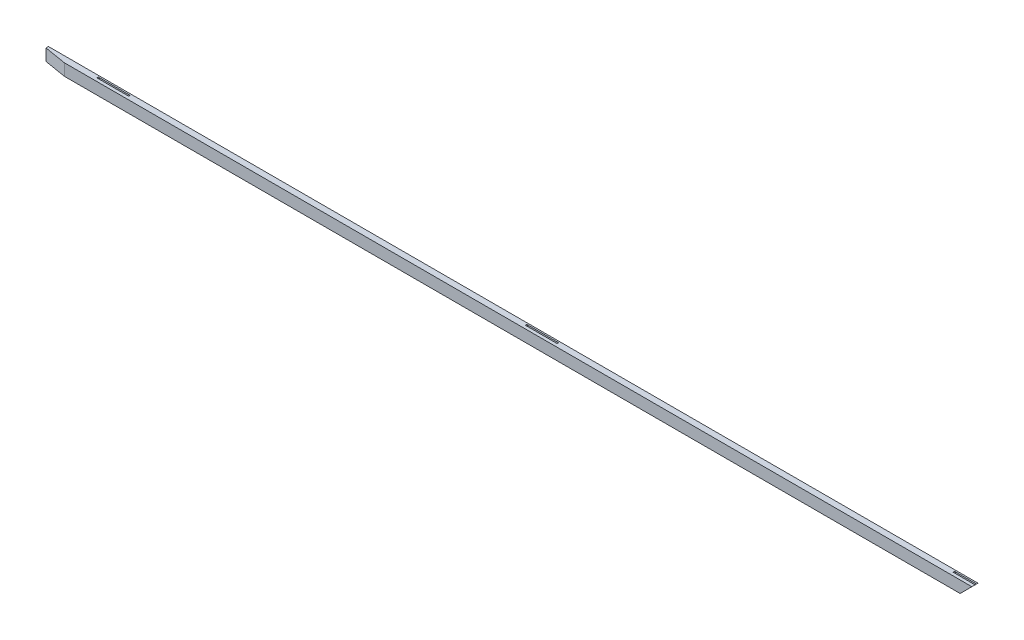
ISO-10303-21;
HEADER;
FILE_DESCRIPTION(('STEP AP214'),'2;1');
FILE_NAME('part.step','',(''),(''),'','','');
FILE_SCHEMA(('AUTOMOTIVE_DESIGN { 1 0 10303 214 1 1 1 1 }'));
ENDSEC;
DATA;
#1=APPLICATION_CONTEXT('core data for automotive mechanical design processes');
#2=APPLICATION_PROTOCOL_DEFINITION('international standard','automotive_design',2000,#1);
#3=PRODUCT_CONTEXT('',#1,'mechanical');
#4=PRODUCT('Part','Part','',(#3));
#5=PRODUCT_RELATED_PRODUCT_CATEGORY('part','',(#4));
#6=PRODUCT_DEFINITION_FORMATION('','',#4);
#7=PRODUCT_DEFINITION_CONTEXT('part definition',#1,'design');
#8=PRODUCT_DEFINITION('design','',#6,#7);
#9=PRODUCT_DEFINITION_SHAPE('','',#8);
#10=(LENGTH_UNIT() NAMED_UNIT(*) SI_UNIT(.MILLI.,.METRE.));
#11=(NAMED_UNIT(*) PLANE_ANGLE_UNIT() SI_UNIT($,.RADIAN.));
#12=(NAMED_UNIT(*) SI_UNIT($,.STERADIAN.) SOLID_ANGLE_UNIT());
#13=UNCERTAINTY_MEASURE_WITH_UNIT(LENGTH_MEASURE(1.E-05),#10,'distance_accuracy_value','');
#14=(GEOMETRIC_REPRESENTATION_CONTEXT(3) GLOBAL_UNCERTAINTY_ASSIGNED_CONTEXT((#13)) GLOBAL_UNIT_ASSIGNED_CONTEXT((#10,
#11,#12)) REPRESENTATION_CONTEXT('',''));
#15=CARTESIAN_POINT('',(0.,0.,0.));
#16=DIRECTION('',(0.,0.,1.));
#17=DIRECTION('',(1.,0.,0.));
#18=AXIS2_PLACEMENT_3D('',#15,#16,#17);
#19=CARTESIAN_POINT('',(3798.,24.0000000000012,25.));
#20=DIRECTION('',(0.,-1.,0.));
#21=DIRECTION('',(1.,0.,0.));
#22=AXIS2_PLACEMENT_3D('',#19,#20,#21);
#23=PLANE('',#22);
#24=DIRECTION('',(0.,0.,1.));
#25=VECTOR('',#24,1.);
#26=CARTESIAN_POINT('',(1960.,23.9999999999998,11.9999999999999));
#27=LINE('',#26,#25);
#28=CARTESIAN_POINT('',(1960.,23.9999999999998,11.9999999999999));
#29=VERTEX_POINT('',#28);
#30=CARTESIAN_POINT('',(1960.,23.9999999999998,6.));
#31=VERTEX_POINT('',#30);
#32=EDGE_CURVE('E247',#29,#31,#27,.F.);
#33=ORIENTED_EDGE('',*,*,#32,.T.);
#34=DIRECTION('',(1.,0.,0.));
#35=VECTOR('',#34,1.);
#36=CARTESIAN_POINT('',(1967.5,23.9999999999998,6.));
#37=LINE('',#36,#35);
#38=CARTESIAN_POINT('',(2090.,23.9999999999998,6.00000000000002));
#39=VERTEX_POINT('',#38);
#40=EDGE_CURVE('E283',#31,#39,#37,.T.);
#41=ORIENTED_EDGE('',*,*,#40,.T.);
#42=DIRECTION('',(0.,0.,-1.));
#43=VECTOR('',#42,1.);
#44=CARTESIAN_POINT('',(2090.,23.9999999999998,6.00000000000001));
#45=LINE('',#44,#43);
#46=CARTESIAN_POINT('',(2090.,23.9999999999998,12.));
#47=VERTEX_POINT('',#46);
#48=EDGE_CURVE('E302',#39,#47,#45,.F.);
#49=ORIENTED_EDGE('',*,*,#48,.T.);
#50=DIRECTION('',(-1.,0.,0.));
#51=VECTOR('',#50,1.);
#52=CARTESIAN_POINT('',(2082.5,23.9999999999998,12.));
#53=LINE('',#52,#51);
#54=EDGE_CURVE('E297',#47,#29,#53,.T.);
#55=ORIENTED_EDGE('',*,*,#54,.T.);
#56=EDGE_LOOP('',(#33,#41,#49,#55));
#57=FACE_BOUND('',#56,.T.);
#58=DIRECTION('',(0.,0.,1.));
#59=VECTOR('',#58,1.);
#60=CARTESIAN_POINT('',(209.999999999999,23.9999999999998,11.9999999999999));
#61=LINE('',#60,#59);
#62=CARTESIAN_POINT('',(209.999999999999,23.9999999999998,11.9999999999999));
#63=VERTEX_POINT('',#62);
#64=CARTESIAN_POINT('',(209.999999999999,23.9999999999998,6.));
#65=VERTEX_POINT('',#64);
#66=EDGE_CURVE('E345',#63,#65,#61,.F.);
#67=ORIENTED_EDGE('',*,*,#66,.T.);
#68=DIRECTION('',(1.,0.,0.));
#69=VECTOR('',#68,1.);
#70=CARTESIAN_POINT('',(217.499999999999,23.9999999999998,6.));
#71=LINE('',#70,#69);
#72=CARTESIAN_POINT('',(339.999999999999,23.9999999999998,6.00000000000002));
#73=VERTEX_POINT('',#72);
#74=EDGE_CURVE('E352',#65,#73,#71,.T.);
#75=ORIENTED_EDGE('',*,*,#74,.T.);
#76=DIRECTION('',(0.,0.,-1.));
#77=VECTOR('',#76,1.);
#78=CARTESIAN_POINT('',(339.999999999999,23.9999999999998,6.00000000000001));
#79=LINE('',#78,#77);
#80=CARTESIAN_POINT('',(339.999999999999,23.9999999999998,12.));
#81=VERTEX_POINT('',#80);
#82=EDGE_CURVE('E11',#73,#81,#79,.F.);
#83=ORIENTED_EDGE('',*,*,#82,.T.);
#84=DIRECTION('',(-1.,0.,0.));
#85=VECTOR('',#84,1.);
#86=CARTESIAN_POINT('',(332.5,23.9999999999998,12.));
#87=LINE('',#86,#85);
#88=EDGE_CURVE('E335',#81,#63,#87,.T.);
#89=ORIENTED_EDGE('',*,*,#88,.T.);
#90=EDGE_LOOP('',(#67,#75,#83,#89));
#91=FACE_BOUND('',#90,.T.);
#92=DIRECTION('',(0.,0.,-1.));
#93=VECTOR('',#92,1.);
#94=CARTESIAN_POINT('',(0.,24.0000000000002,25.));
#95=LINE('',#94,#93);
#96=CARTESIAN_POINT('',(0.,24.0000000000002,10.));
#97=VERTEX_POINT('',#96);
#98=CARTESIAN_POINT('',(0.,24.0000000000002,0.));
#99=VERTEX_POINT('',#98);
#100=EDGE_CURVE('E240',#97,#99,#95,.T.);
#101=ORIENTED_EDGE('',*,*,#100,.F.);
#102=DIRECTION('',(-0.986393923832144,0.,-0.164398987305357));
#103=VECTOR('',#102,1.);
#104=CARTESIAN_POINT('',(0.,24.0000000000002,10.));
#105=LINE('',#104,#103);
#106=CARTESIAN_POINT('',(90.,24.0000000000012,25.));
#107=VERTEX_POINT('',#106);
#108=EDGE_CURVE('E225',#107,#97,#105,.T.);
#109=ORIENTED_EDGE('',*,*,#108,.F.);
#110=DIRECTION('',(-1.,0.,0.));
#111=VECTOR('',#110,1.);
#112=CARTESIAN_POINT('',(3798.,24.0000000000012,25.));
#113=LINE('',#112,#111);
#114=CARTESIAN_POINT('',(3798.,24.0000000000012,25.));
#115=VERTEX_POINT('',#114);
#116=EDGE_CURVE('E733',#115,#107,#113,.T.);
#117=ORIENTED_EDGE('',*,*,#116,.F.);
#118=DIRECTION('',(0.,0.,-1.));
#119=VECTOR('',#118,1.);
#120=CARTESIAN_POINT('',(3798.,24.0000000000012,25.));
#121=LINE('',#120,#119);
#122=CARTESIAN_POINT('',(3798.,24.0000000000012,12.));
#123=VERTEX_POINT('',#122);
#124=EDGE_CURVE('E728',#115,#123,#121,.T.);
#125=ORIENTED_EDGE('',*,*,#124,.T.);
#126=DIRECTION('',(-1.,0.,0.));
#127=VECTOR('',#126,1.);
#128=CARTESIAN_POINT('',(3798.,24.0000000000012,12.));
#129=LINE('',#128,#127);
#130=CARTESIAN_POINT('',(3708.5,24.0000000000012,12.));
#131=VERTEX_POINT('',#130);
#132=EDGE_CURVE('E714',#123,#131,#129,.T.);
#133=ORIENTED_EDGE('',*,*,#132,.T.);
#134=DIRECTION('',(0.,0.,1.));
#135=VECTOR('',#134,1.);
#136=CARTESIAN_POINT('',(3708.5,24.0000000000012,6.));
#137=LINE('',#136,#135);
#138=CARTESIAN_POINT('',(3708.5,24.0000000000012,6.));
#139=VERTEX_POINT('',#138);
#140=EDGE_CURVE('E801',#139,#131,#137,.T.);
#141=ORIENTED_EDGE('',*,*,#140,.F.);
#142=DIRECTION('',(-1.,0.,0.));
#143=VECTOR('',#142,1.);
#144=CARTESIAN_POINT('',(3798.,24.0000000000012,6.));
#145=LINE('',#144,#143);
#146=CARTESIAN_POINT('',(3798.,24.0000000000012,6.));
#147=VERTEX_POINT('',#146);
#148=EDGE_CURVE('E730',#147,#139,#145,.T.);
#149=ORIENTED_EDGE('',*,*,#148,.F.);
#150=CARTESIAN_POINT('',(3798.,24.0000000000012,0.));
#151=VERTEX_POINT('',#150);
#152=EDGE_CURVE('E735',#147,#151,#121,.T.);
#153=ORIENTED_EDGE('',*,*,#152,.T.);
#154=DIRECTION('',(-1.,0.,0.));
#155=VECTOR('',#154,1.);
#156=CARTESIAN_POINT('',(3798.,24.0000000000012,0.));
#157=LINE('',#156,#155);
#158=EDGE_CURVE('E246',#151,#99,#157,.T.);
#159=ORIENTED_EDGE('',*,*,#158,.T.);
#160=EDGE_LOOP('',(#101,#109,#117,#125,#133,#141,#149,#153,#159));
#161=FACE_BOUND('',#160,.T.);
#162=ADVANCED_FACE('F35',(#57,#91,#161),#23,.F.);
#163=CARTESIAN_POINT('',(3750.,-23.9999999999998,25.));
#164=DIRECTION('',(-0.707106781186548,0.707106781186547,0.));
#165=DIRECTION('',(-0.707106781186547,-0.707106781186548,0.));
#166=AXIS2_PLACEMENT_3D('',#163,#164,#165);
#167=PLANE('',#166);
#168=DIRECTION('',(0.70710678118654,0.707106781186556,0.));
#169=VECTOR('',#168,1.);
#170=CARTESIAN_POINT('',(3790.5,16.5000000000012,6.));
#171=LINE('',#170,#169);
#172=CARTESIAN_POINT('',(3790.5,16.5000000000012,6.));
#173=VERTEX_POINT('',#172);
#174=EDGE_CURVE('E806',#173,#147,#171,.T.);
#175=ORIENTED_EDGE('',*,*,#174,.F.);
#176=DIRECTION('',(0.,0.,1.));
#177=VECTOR('',#176,1.);
#178=CARTESIAN_POINT('',(3790.5,16.5000000000012,6.));
#179=LINE('',#178,#177);
#180=CARTESIAN_POINT('',(3790.5,16.5000000000012,12.));
#181=VERTEX_POINT('',#180);
#182=EDGE_CURVE('E729',#173,#181,#179,.T.);
#183=ORIENTED_EDGE('',*,*,#182,.T.);
#184=DIRECTION('',(0.70710678118654,0.707106781186556,0.));
#185=VECTOR('',#184,1.);
#186=CARTESIAN_POINT('',(3790.5,16.5000000000012,12.));
#187=LINE('',#186,#185);
#188=EDGE_CURVE('E717',#181,#123,#187,.T.);
#189=ORIENTED_EDGE('',*,*,#188,.T.);
#190=ORIENTED_EDGE('',*,*,#124,.F.);
#191=DIRECTION('',(0.707106781186547,0.707106781186548,0.));
#192=VECTOR('',#191,1.);
#193=CARTESIAN_POINT('',(3750.,-23.9999999999998,25.));
#194=LINE('',#193,#192);
#195=CARTESIAN_POINT('',(3750.,-23.9999999999998,25.));
#196=VERTEX_POINT('',#195);
#197=EDGE_CURVE('E737',#196,#115,#194,.T.);
#198=ORIENTED_EDGE('',*,*,#197,.F.);
#199=DIRECTION('',(0.,0.,-1.));
#200=VECTOR('',#199,1.);
#201=CARTESIAN_POINT('',(3750.,-23.9999999999998,25.));
#202=LINE('',#201,#200);
#203=CARTESIAN_POINT('',(3750.,-23.9999999999998,12.));
#204=VERTEX_POINT('',#203);
#205=EDGE_CURVE('E252',#196,#204,#202,.T.);
#206=ORIENTED_EDGE('',*,*,#205,.T.);
#207=DIRECTION('',(0.707106781186561,0.707106781186534,0.));
#208=VECTOR('',#207,1.);
#209=CARTESIAN_POINT('',(3757.5,-16.4999999999998,12.));
#210=LINE('',#209,#208);
#211=CARTESIAN_POINT('',(3757.5,-16.4999999999998,12.));
#212=VERTEX_POINT('',#211);
#213=EDGE_CURVE('E745',#204,#212,#210,.T.);
#214=ORIENTED_EDGE('',*,*,#213,.T.);
#215=DIRECTION('',(0.,0.,1.));
#216=VECTOR('',#215,1.);
#217=CARTESIAN_POINT('',(3757.5,-16.4999999999998,6.));
#218=LINE('',#217,#216);
#219=CARTESIAN_POINT('',(3757.5,-16.4999999999998,6.));
#220=VERTEX_POINT('',#219);
#221=EDGE_CURVE('E766',#220,#212,#218,.T.);
#222=ORIENTED_EDGE('',*,*,#221,.F.);
#223=DIRECTION('',(0.707106781186561,0.707106781186534,0.));
#224=VECTOR('',#223,1.);
#225=CARTESIAN_POINT('',(3757.5,-16.4999999999998,6.));
#226=LINE('',#225,#224);
#227=CARTESIAN_POINT('',(3750.,-23.9999999999998,6.));
#228=VERTEX_POINT('',#227);
#229=EDGE_CURVE('E795',#228,#220,#226,.T.);
#230=ORIENTED_EDGE('',*,*,#229,.F.);
#231=CARTESIAN_POINT('',(3750.,-23.9999999999998,0.));
#232=VERTEX_POINT('',#231);
#233=EDGE_CURVE('E734',#228,#232,#202,.T.);
#234=ORIENTED_EDGE('',*,*,#233,.T.);
#235=DIRECTION('',(0.707106781186547,0.707106781186548,0.));
#236=VECTOR('',#235,1.);
#237=CARTESIAN_POINT('',(3750.,-23.9999999999998,0.));
#238=LINE('',#237,#236);
#239=EDGE_CURVE('E739',#232,#151,#238,.T.);
#240=ORIENTED_EDGE('',*,*,#239,.T.);
#241=ORIENTED_EDGE('',*,*,#152,.F.);
#242=EDGE_LOOP('',(#175,#183,#189,#190,#198,#206,#214,#222,#230,#234,#240,#241));
#243=FACE_BOUND('',#242,.T.);
#244=ADVANCED_FACE('F387',(#243),#167,.F.);
#245=CARTESIAN_POINT('',(332.5,16.4999999999998,6.00000000000001));
#246=DIRECTION('',(-0.707106781186546,0.707106781186549,0.));
#247=DIRECTION('',(0.707106781186549,0.707106781186546,0.));
#248=AXIS2_PLACEMENT_3D('',#245,#246,#247);
#249=PLANE('',#248);
#250=ORIENTED_EDGE('',*,*,#82,.F.);
#251=DIRECTION('',(-0.707106781186549,-0.707106781186546,0.));
#252=VECTOR('',#251,1.);
#253=CARTESIAN_POINT('',(274.999999999999,-41.0000000000003,6.00000000000001));
#254=LINE('',#253,#252);
#255=CARTESIAN_POINT('',(332.5,16.4999999999998,6.00000000000001));
#256=VERTEX_POINT('',#255);
#257=EDGE_CURVE('E356',#256,#73,#254,.F.);
#258=ORIENTED_EDGE('',*,*,#257,.F.);
#259=DIRECTION('',(0.,0.,1.));
#260=VECTOR('',#259,1.);
#261=CARTESIAN_POINT('',(332.5,16.4999999999998,6.00000000000001));
#262=LINE('',#261,#260);
#263=CARTESIAN_POINT('',(332.5,16.4999999999998,12.));
#264=VERTEX_POINT('',#263);
#265=EDGE_CURVE('E43',#256,#264,#262,.T.);
#266=ORIENTED_EDGE('',*,*,#265,.T.);
#267=DIRECTION('',(-0.707106781186549,-0.707106781186546,0.));
#268=VECTOR('',#267,1.);
#269=CARTESIAN_POINT('',(332.5,16.4999999999998,12.));
#270=LINE('',#269,#268);
#271=EDGE_CURVE('E337',#264,#81,#270,.F.);
#272=ORIENTED_EDGE('',*,*,#271,.T.);
#273=EDGE_LOOP('',(#250,#258,#266,#272));
#274=FACE_BOUND('',#273,.T.);
#275=ADVANCED_FACE('F37',(#274),#249,.T.);
#276=CARTESIAN_POINT('',(-1750.,16.4999999999998,0.));
#277=DIRECTION('',(0.,1.,0.));
#278=DIRECTION('',(0.,0.,-1.));
#279=AXIS2_PLACEMENT_3D('',#276,#277,#278);
#280=PLANE('',#279);
#281=DIRECTION('',(-1.,0.,0.));
#282=VECTOR('',#281,1.);
#283=CARTESIAN_POINT('',(332.5,16.4999999999998,12.));
#284=LINE('',#283,#282);
#285=CARTESIAN_POINT('',(217.499999999999,16.4999999999998,11.9999999999999));
#286=VERTEX_POINT('',#285);
#287=EDGE_CURVE('E340',#264,#286,#284,.T.);
#288=ORIENTED_EDGE('',*,*,#287,.F.);
#289=ORIENTED_EDGE('',*,*,#265,.F.);
#290=DIRECTION('',(1.,0.,0.));
#291=VECTOR('',#290,1.);
#292=CARTESIAN_POINT('',(217.499999999999,16.4999999999998,6.));
#293=LINE('',#292,#291);
#294=CARTESIAN_POINT('',(217.499999999999,16.4999999999998,6.));
#295=VERTEX_POINT('',#294);
#296=EDGE_CURVE('E354',#295,#256,#293,.T.);
#297=ORIENTED_EDGE('',*,*,#296,.F.);
#298=DIRECTION('',(0.,0.,-1.));
#299=VECTOR('',#298,1.);
#300=CARTESIAN_POINT('',(217.499999999999,16.4999999999998,11.9999999999999));
#301=LINE('',#300,#299);
#302=EDGE_CURVE('E347',#286,#295,#301,.T.);
#303=ORIENTED_EDGE('',*,*,#302,.F.);
#304=EDGE_LOOP('',(#288,#289,#297,#303));
#305=FACE_BOUND('',#304,.T.);
#306=ADVANCED_FACE('F366',(#305),#280,.T.);
#307=CARTESIAN_POINT('',(217.499999999999,16.4999999999998,6.));
#308=DIRECTION('',(0.,0.,-1.));
#309=DIRECTION('',(-1.,0.,0.));
#310=AXIS2_PLACEMENT_3D('',#307,#308,#309);
#311=PLANE('',#310);
#312=ORIENTED_EDGE('',*,*,#74,.F.);
#313=DIRECTION('',(0.707106781186549,-0.707106781186546,0.));
#314=VECTOR('',#313,1.);
#315=CARTESIAN_POINT('',(217.499999999999,16.4999999999998,6.));
#316=LINE('',#315,#314);
#317=EDGE_CURVE('E349',#295,#65,#316,.F.);
#318=ORIENTED_EDGE('',*,*,#317,.F.);
#319=ORIENTED_EDGE('',*,*,#296,.T.);
#320=ORIENTED_EDGE('',*,*,#257,.T.);
#321=EDGE_LOOP('',(#312,#318,#319,#320));
#322=FACE_BOUND('',#321,.T.);
#323=ADVANCED_FACE('F378',(#322),#311,.F.);
#324=CARTESIAN_POINT('',(217.499999999999,16.4999999999998,11.9999999999999));
#325=DIRECTION('',(0.707106781186546,0.707106781186549,0.));
#326=DIRECTION('',(0.707106781186549,-0.707106781186546,0.));
#327=AXIS2_PLACEMENT_3D('',#324,#325,#326);
#328=PLANE('',#327);
#329=ORIENTED_EDGE('',*,*,#66,.F.);
#330=DIRECTION('',(0.707106781186549,-0.707106781186546,0.));
#331=VECTOR('',#330,1.);
#332=CARTESIAN_POINT('',(274.999999999999,-41.0000000000003,12.));
#333=LINE('',#332,#331);
#334=EDGE_CURVE('E342',#286,#63,#333,.F.);
#335=ORIENTED_EDGE('',*,*,#334,.F.);
#336=ORIENTED_EDGE('',*,*,#302,.T.);
#337=ORIENTED_EDGE('',*,*,#317,.T.);
#338=EDGE_LOOP('',(#329,#335,#336,#337));
#339=FACE_BOUND('',#338,.T.);
#340=ADVANCED_FACE('F373',(#339),#328,.T.);
#341=CARTESIAN_POINT('',(332.5,16.4999999999998,12.));
#342=DIRECTION('',(0.,0.,1.));
#343=DIRECTION('',(1.,0.,0.));
#344=AXIS2_PLACEMENT_3D('',#341,#342,#343);
#345=PLANE('',#344);
#346=ORIENTED_EDGE('',*,*,#88,.F.);
#347=ORIENTED_EDGE('',*,*,#271,.F.);
#348=ORIENTED_EDGE('',*,*,#287,.T.);
#349=ORIENTED_EDGE('',*,*,#334,.T.);
#350=EDGE_LOOP('',(#346,#347,#348,#349));
#351=FACE_BOUND('',#350,.T.);
#352=ADVANCED_FACE('F370',(#351),#345,.F.);
#353=CARTESIAN_POINT('',(332.5,-16.4999999999998,6.00000000000001));
#354=DIRECTION('',(-0.707106781186546,-0.707106781186549,0.));
#355=DIRECTION('',(0.707106781186549,-0.707106781186546,0.));
#356=AXIS2_PLACEMENT_3D('',#353,#354,#355);
#357=PLANE('',#356);
#358=DIRECTION('',(0.,0.,-1.));
#359=VECTOR('',#358,1.);
#360=CARTESIAN_POINT('',(339.999999999999,-23.9999999999998,6.00000000000001));
#361=LINE('',#360,#359);
#362=CARTESIAN_POINT('',(339.999999999999,-23.9999999999998,6.00000000000002));
#363=VERTEX_POINT('',#362);
#364=CARTESIAN_POINT('',(339.999999999999,-23.9999999999998,12.));
#365=VERTEX_POINT('',#364);
#366=EDGE_CURVE('E332',#363,#365,#361,.F.);
#367=ORIENTED_EDGE('',*,*,#366,.T.);
#368=DIRECTION('',(-0.707106781186549,0.707106781186546,0.));
#369=VECTOR('',#368,1.);
#370=CARTESIAN_POINT('',(332.5,-16.4999999999998,12.));
#371=LINE('',#370,#369);
#372=CARTESIAN_POINT('',(332.5,-16.4999999999998,12.));
#373=VERTEX_POINT('',#372);
#374=EDGE_CURVE('E312',#373,#365,#371,.F.);
#375=ORIENTED_EDGE('',*,*,#374,.F.);
#376=DIRECTION('',(0.,0.,1.));
#377=VECTOR('',#376,1.);
#378=CARTESIAN_POINT('',(332.5,-16.4999999999998,6.00000000000001));
#379=LINE('',#378,#377);
#380=CARTESIAN_POINT('',(332.5,-16.4999999999998,6.00000000000001));
#381=VERTEX_POINT('',#380);
#382=EDGE_CURVE('E319',#381,#373,#379,.T.);
#383=ORIENTED_EDGE('',*,*,#382,.F.);
#384=DIRECTION('',(-0.707106781186549,0.707106781186546,0.));
#385=VECTOR('',#384,1.);
#386=CARTESIAN_POINT('',(274.999999999999,41.0000000000003,6.00000000000001));
#387=LINE('',#386,#385);
#388=EDGE_CURVE('E329',#381,#363,#387,.F.);
#389=ORIENTED_EDGE('',*,*,#388,.T.);
#390=EDGE_LOOP('',(#367,#375,#383,#389));
#391=FACE_BOUND('',#390,.T.);
#392=ADVANCED_FACE('F446',(#391),#357,.T.);
#393=CARTESIAN_POINT('',(217.499999999999,-16.4999999999998,6.));
#394=DIRECTION('',(0.,0.,-1.));
#395=DIRECTION('',(-1.,0.,0.));
#396=AXIS2_PLACEMENT_3D('',#393,#394,#395);
#397=PLANE('',#396);
#398=DIRECTION('',(1.,0.,0.));
#399=VECTOR('',#398,1.);
#400=CARTESIAN_POINT('',(217.499999999999,-23.9999999999998,6.));
#401=LINE('',#400,#399);
#402=CARTESIAN_POINT('',(209.999999999999,-23.9999999999998,6.));
#403=VERTEX_POINT('',#402);
#404=EDGE_CURVE('E327',#403,#363,#401,.T.);
#405=ORIENTED_EDGE('',*,*,#404,.T.);
#406=ORIENTED_EDGE('',*,*,#388,.F.);
#407=DIRECTION('',(1.,0.,0.));
#408=VECTOR('',#407,1.);
#409=CARTESIAN_POINT('',(217.499999999999,-16.4999999999998,6.));
#410=LINE('',#409,#408);
#411=CARTESIAN_POINT('',(217.499999999999,-16.4999999999998,6.));
#412=VERTEX_POINT('',#411);
#413=EDGE_CURVE('E317',#412,#381,#410,.T.);
#414=ORIENTED_EDGE('',*,*,#413,.F.);
#415=DIRECTION('',(0.707106781186549,0.707106781186546,0.));
#416=VECTOR('',#415,1.);
#417=CARTESIAN_POINT('',(217.499999999999,-16.4999999999998,6.));
#418=LINE('',#417,#416);
#419=EDGE_CURVE('E324',#412,#403,#418,.F.);
#420=ORIENTED_EDGE('',*,*,#419,.T.);
#421=EDGE_LOOP('',(#405,#406,#414,#420));
#422=FACE_BOUND('',#421,.T.);
#423=ADVANCED_FACE('F442',(#422),#397,.F.);
#424=CARTESIAN_POINT('',(217.499999999999,-16.4999999999998,11.9999999999999));
#425=DIRECTION('',(0.707106781186546,-0.707106781186549,0.));
#426=DIRECTION('',(0.707106781186549,0.707106781186546,0.));
#427=AXIS2_PLACEMENT_3D('',#424,#425,#426);
#428=PLANE('',#427);
#429=DIRECTION('',(0.,0.,1.));
#430=VECTOR('',#429,1.);
#431=CARTESIAN_POINT('',(209.999999999999,-23.9999999999998,11.9999999999999));
#432=LINE('',#431,#430);
#433=CARTESIAN_POINT('',(209.999999999999,-23.9999999999998,11.9999999999999));
#434=VERTEX_POINT('',#433);
#435=EDGE_CURVE('E322',#434,#403,#432,.F.);
#436=ORIENTED_EDGE('',*,*,#435,.T.);
#437=ORIENTED_EDGE('',*,*,#419,.F.);
#438=DIRECTION('',(0.,0.,-1.));
#439=VECTOR('',#438,1.);
#440=CARTESIAN_POINT('',(217.499999999999,-16.4999999999998,11.9999999999999));
#441=LINE('',#440,#439);
#442=CARTESIAN_POINT('',(217.499999999999,-16.4999999999998,11.9999999999999));
#443=VERTEX_POINT('',#442);
#444=EDGE_CURVE('E315',#443,#412,#441,.T.);
#445=ORIENTED_EDGE('',*,*,#444,.F.);
#446=DIRECTION('',(0.707106781186549,0.707106781186546,0.));
#447=VECTOR('',#446,1.);
#448=CARTESIAN_POINT('',(274.999999999999,41.0000000000003,12.));
#449=LINE('',#448,#447);
#450=EDGE_CURVE('E306',#443,#434,#449,.F.);
#451=ORIENTED_EDGE('',*,*,#450,.T.);
#452=EDGE_LOOP('',(#436,#437,#445,#451));
#453=FACE_BOUND('',#452,.T.);
#454=ADVANCED_FACE('F438',(#453),#428,.T.);
#455=CARTESIAN_POINT('',(-1750.,-16.4999999999998,0.));
#456=DIRECTION('',(0.,-1.,0.));
#457=DIRECTION('',(0.,0.,-1.));
#458=AXIS2_PLACEMENT_3D('',#455,#456,#457);
#459=PLANE('',#458);
#460=DIRECTION('',(-1.,0.,0.));
#461=VECTOR('',#460,1.);
#462=CARTESIAN_POINT('',(332.5,-16.4999999999998,12.));
#463=LINE('',#462,#461);
#464=EDGE_CURVE('E309',#373,#443,#463,.T.);
#465=ORIENTED_EDGE('',*,*,#464,.T.);
#466=ORIENTED_EDGE('',*,*,#444,.T.);
#467=ORIENTED_EDGE('',*,*,#413,.T.);
#468=ORIENTED_EDGE('',*,*,#382,.T.);
#469=EDGE_LOOP('',(#465,#466,#467,#468));
#470=FACE_BOUND('',#469,.T.);
#471=ADVANCED_FACE('F434',(#470),#459,.T.);
#472=CARTESIAN_POINT('',(332.5,-16.4999999999998,12.));
#473=DIRECTION('',(0.,0.,1.));
#474=DIRECTION('',(1.,0.,0.));
#475=AXIS2_PLACEMENT_3D('',#472,#473,#474);
#476=PLANE('',#475);
#477=DIRECTION('',(-1.,0.,0.));
#478=VECTOR('',#477,1.);
#479=CARTESIAN_POINT('',(332.5,-23.9999999999998,12.));
#480=LINE('',#479,#478);
#481=EDGE_CURVE('E304',#365,#434,#480,.T.);
#482=ORIENTED_EDGE('',*,*,#481,.T.);
#483=ORIENTED_EDGE('',*,*,#450,.F.);
#484=ORIENTED_EDGE('',*,*,#464,.F.);
#485=ORIENTED_EDGE('',*,*,#374,.T.);
#486=EDGE_LOOP('',(#482,#483,#484,#485));
#487=FACE_BOUND('',#486,.T.);
#488=ADVANCED_FACE('F430',(#487),#476,.F.);
#489=CARTESIAN_POINT('',(2082.5,16.4999999999998,6.00000000000001));
#490=DIRECTION('',(-0.707106781186546,0.707106781186549,0.));
#491=DIRECTION('',(0.707106781186549,0.707106781186546,0.));
#492=AXIS2_PLACEMENT_3D('',#489,#490,#491);
#493=PLANE('',#492);
#494=ORIENTED_EDGE('',*,*,#48,.F.);
#495=DIRECTION('',(-0.707106781186549,-0.707106781186546,0.));
#496=VECTOR('',#495,1.);
#497=CARTESIAN_POINT('',(2025.,-41.0000000000003,6.00000000000001));
#498=LINE('',#497,#496);
#499=CARTESIAN_POINT('',(2082.5,16.4999999999998,6.00000000000001));
#500=VERTEX_POINT('',#499);
#501=EDGE_CURVE('E286',#500,#39,#498,.F.);
#502=ORIENTED_EDGE('',*,*,#501,.F.);
#503=DIRECTION('',(0.,0.,1.));
#504=VECTOR('',#503,1.);
#505=CARTESIAN_POINT('',(2082.5,16.4999999999998,6.00000000000001));
#506=LINE('',#505,#504);
#507=CARTESIAN_POINT('',(2082.5,16.4999999999998,12.));
#508=VERTEX_POINT('',#507);
#509=EDGE_CURVE('E294',#500,#508,#506,.T.);
#510=ORIENTED_EDGE('',*,*,#509,.T.);
#511=DIRECTION('',(-0.707106781186549,-0.707106781186546,0.));
#512=VECTOR('',#511,1.);
#513=CARTESIAN_POINT('',(2082.5,16.4999999999998,12.));
#514=LINE('',#513,#512);
#515=EDGE_CURVE('E299',#508,#47,#514,.F.);
#516=ORIENTED_EDGE('',*,*,#515,.T.);
#517=EDGE_LOOP('',(#494,#502,#510,#516));
#518=FACE_BOUND('',#517,.T.);
#519=ADVANCED_FACE('F426',(#518),#493,.T.);
#520=CARTESIAN_POINT('',(2082.5,16.4999999999998,12.));
#521=DIRECTION('',(0.,0.,1.));
#522=DIRECTION('',(1.,0.,0.));
#523=AXIS2_PLACEMENT_3D('',#520,#521,#522);
#524=PLANE('',#523);
#525=ORIENTED_EDGE('',*,*,#54,.F.);
#526=ORIENTED_EDGE('',*,*,#515,.F.);
#527=DIRECTION('',(-1.,0.,0.));
#528=VECTOR('',#527,1.);
#529=CARTESIAN_POINT('',(2082.5,16.4999999999998,12.));
#530=LINE('',#529,#528);
#531=CARTESIAN_POINT('',(1967.5,16.4999999999998,11.9999999999999));
#532=VERTEX_POINT('',#531);
#533=EDGE_CURVE('E292',#508,#532,#530,.T.);
#534=ORIENTED_EDGE('',*,*,#533,.T.);
#535=DIRECTION('',(0.707106781186549,-0.707106781186546,0.));
#536=VECTOR('',#535,1.);
#537=CARTESIAN_POINT('',(2025.,-41.0000000000003,12.));
#538=LINE('',#537,#536);
#539=EDGE_CURVE('E280',#532,#29,#538,.F.);
#540=ORIENTED_EDGE('',*,*,#539,.T.);
#541=EDGE_LOOP('',(#525,#526,#534,#540));
#542=FACE_BOUND('',#541,.T.);
#543=ADVANCED_FACE('F422',(#542),#524,.F.);
#544=CARTESIAN_POINT('',(0.,16.4999999999998,0.));
#545=DIRECTION('',(0.,1.,0.));
#546=DIRECTION('',(0.,0.,-1.));
#547=AXIS2_PLACEMENT_3D('',#544,#545,#546);
#548=PLANE('',#547);
#549=ORIENTED_EDGE('',*,*,#533,.F.);
#550=ORIENTED_EDGE('',*,*,#509,.F.);
#551=DIRECTION('',(1.,0.,0.));
#552=VECTOR('',#551,1.);
#553=CARTESIAN_POINT('',(1967.5,16.4999999999998,6.));
#554=LINE('',#553,#552);
#555=CARTESIAN_POINT('',(1967.5,16.4999999999998,6.));
#556=VERTEX_POINT('',#555);
#557=EDGE_CURVE('E289',#556,#500,#554,.T.);
#558=ORIENTED_EDGE('',*,*,#557,.F.);
#559=DIRECTION('',(0.,0.,-1.));
#560=VECTOR('',#559,1.);
#561=CARTESIAN_POINT('',(1967.5,16.4999999999998,11.9999999999999));
#562=LINE('',#561,#560);
#563=EDGE_CURVE('E277',#532,#556,#562,.T.);
#564=ORIENTED_EDGE('',*,*,#563,.F.);
#565=EDGE_LOOP('',(#549,#550,#558,#564));
#566=FACE_BOUND('',#565,.T.);
#567=ADVANCED_FACE('F418',(#566),#548,.T.);
#568=CARTESIAN_POINT('',(1967.5,16.4999999999998,6.));
#569=DIRECTION('',(0.,0.,-1.));
#570=DIRECTION('',(-1.,0.,0.));
#571=AXIS2_PLACEMENT_3D('',#568,#569,#570);
#572=PLANE('',#571);
#573=ORIENTED_EDGE('',*,*,#40,.F.);
#574=DIRECTION('',(0.707106781186549,-0.707106781186546,0.));
#575=VECTOR('',#574,1.);
#576=CARTESIAN_POINT('',(1967.5,16.4999999999998,6.));
#577=LINE('',#576,#575);
#578=EDGE_CURVE('E250',#556,#31,#577,.F.);
#579=ORIENTED_EDGE('',*,*,#578,.F.);
#580=ORIENTED_EDGE('',*,*,#557,.T.);
#581=ORIENTED_EDGE('',*,*,#501,.T.);
#582=EDGE_LOOP('',(#573,#579,#580,#581));
#583=FACE_BOUND('',#582,.T.);
#584=ADVANCED_FACE('F414',(#583),#572,.F.);
#585=CARTESIAN_POINT('',(1967.5,16.4999999999998,11.9999999999999));
#586=DIRECTION('',(0.707106781186546,0.707106781186549,0.));
#587=DIRECTION('',(0.707106781186549,-0.707106781186546,0.));
#588=AXIS2_PLACEMENT_3D('',#585,#586,#587);
#589=PLANE('',#588);
#590=ORIENTED_EDGE('',*,*,#32,.F.);
#591=ORIENTED_EDGE('',*,*,#539,.F.);
#592=ORIENTED_EDGE('',*,*,#563,.T.);
#593=ORIENTED_EDGE('',*,*,#578,.T.);
#594=EDGE_LOOP('',(#590,#591,#592,#593));
#595=FACE_BOUND('',#594,.T.);
#596=ADVANCED_FACE('F411',(#595),#589,.T.);
#597=CARTESIAN_POINT('',(0.,24.0000000000002,25.));
#598=DIRECTION('',(1.,0.,0.));
#599=DIRECTION('',(0.,0.,-1.));
#600=AXIS2_PLACEMENT_3D('',#597,#598,#599);
#601=PLANE('',#600);
#602=DIRECTION('',(0.,0.,-1.));
#603=VECTOR('',#602,1.);
#604=CARTESIAN_POINT('',(0.,-23.9999999999998,25.));
#605=LINE('',#604,#603);
#606=CARTESIAN_POINT('',(0.,-23.9999999999998,10.));
#607=VERTEX_POINT('',#606);
#608=CARTESIAN_POINT('',(0.,-23.9999999999998,0.));
#609=VERTEX_POINT('',#608);
#610=EDGE_CURVE('E242',#607,#609,#605,.T.);
#611=ORIENTED_EDGE('',*,*,#610,.F.);
#612=DIRECTION('',(0.,-1.,0.));
#613=VECTOR('',#612,1.);
#614=CARTESIAN_POINT('',(0.,24.0010000000012,10.));
#615=LINE('',#614,#613);
#616=EDGE_CURVE('E228',#97,#607,#615,.T.);
#617=ORIENTED_EDGE('',*,*,#616,.F.);
#618=ORIENTED_EDGE('',*,*,#100,.T.);
#619=DIRECTION('',(0.,-1.,0.));
#620=VECTOR('',#619,1.);
#621=CARTESIAN_POINT('',(0.,24.0000000000002,0.));
#622=LINE('',#621,#620);
#623=EDGE_CURVE('E785',#99,#609,#622,.T.);
#624=ORIENTED_EDGE('',*,*,#623,.T.);
#625=EDGE_LOOP('',(#611,#617,#618,#624));
#626=FACE_BOUND('',#625,.T.);
#627=ADVANCED_FACE('F238',(#626),#601,.F.);
#628=CARTESIAN_POINT('',(0.,-23.9999999999998,25.));
#629=DIRECTION('',(0.,1.,0.));
#630=DIRECTION('',(0.,0.,1.));
#631=AXIS2_PLACEMENT_3D('',#628,#629,#630);
#632=PLANE('',#631);
#633=ORIENTED_EDGE('',*,*,#435,.F.);
#634=ORIENTED_EDGE('',*,*,#481,.F.);
#635=ORIENTED_EDGE('',*,*,#366,.F.);
#636=ORIENTED_EDGE('',*,*,#404,.F.);
#637=EDGE_LOOP('',(#633,#634,#635,#636));
#638=FACE_BOUND('',#637,.T.);
#639=DIRECTION('',(0.,0.,1.));
#640=VECTOR('',#639,1.);
#641=CARTESIAN_POINT('',(1960.,-23.9999999999998,11.9999999999999));
#642=LINE('',#641,#640);
#643=CARTESIAN_POINT('',(1960.,-23.9999999999998,11.9999999999999));
#644=VERTEX_POINT('',#643);
#645=CARTESIAN_POINT('',(1960.,-23.9999999999998,6.));
#646=VERTEX_POINT('',#645);
#647=EDGE_CURVE('E266',#644,#646,#642,.F.);
#648=ORIENTED_EDGE('',*,*,#647,.F.);
#649=DIRECTION('',(-1.,0.,0.));
#650=VECTOR('',#649,1.);
#651=CARTESIAN_POINT('',(2082.5,-23.9999999999998,12.));
#652=LINE('',#651,#650);
#653=CARTESIAN_POINT('',(2090.,-23.9999999999998,12.));
#654=VERTEX_POINT('',#653);
#655=EDGE_CURVE('E269',#654,#644,#652,.T.);
#656=ORIENTED_EDGE('',*,*,#655,.F.);
#657=DIRECTION('',(0.,0.,-1.));
#658=VECTOR('',#657,1.);
#659=CARTESIAN_POINT('',(2090.,-23.9999999999998,6.00000000000001));
#660=LINE('',#659,#658);
#661=CARTESIAN_POINT('',(2090.,-23.9999999999998,6.00000000000002));
#662=VERTEX_POINT('',#661);
#663=EDGE_CURVE('E256',#662,#654,#660,.F.);
#664=ORIENTED_EDGE('',*,*,#663,.F.);
#665=DIRECTION('',(1.,0.,0.));
#666=VECTOR('',#665,1.);
#667=CARTESIAN_POINT('',(1967.5,-23.9999999999998,6.));
#668=LINE('',#667,#666);
#669=EDGE_CURVE('E260',#646,#662,#668,.T.);
#670=ORIENTED_EDGE('',*,*,#669,.F.);
#671=EDGE_LOOP('',(#648,#656,#664,#670));
#672=FACE_BOUND('',#671,.T.);
#673=DIRECTION('',(1.,0.,0.));
#674=VECTOR('',#673,1.);
#675=CARTESIAN_POINT('',(0.,-23.9999999999998,25.));
#676=LINE('',#675,#674);
#677=CARTESIAN_POINT('',(90.,-23.9999999999998,25.));
#678=VERTEX_POINT('',#677);
#679=EDGE_CURVE('E749',#678,#196,#676,.T.);
#680=ORIENTED_EDGE('',*,*,#679,.F.);
#681=DIRECTION('',(0.986393923832144,0.,0.164398987305357));
#682=VECTOR('',#681,1.);
#683=CARTESIAN_POINT('',(0.,-23.9999999999998,10.));
#684=LINE('',#683,#682);
#685=EDGE_CURVE('E50',#607,#678,#684,.T.);
#686=ORIENTED_EDGE('',*,*,#685,.F.);
#687=ORIENTED_EDGE('',*,*,#610,.T.);
#688=DIRECTION('',(1.,0.,0.));
#689=VECTOR('',#688,1.);
#690=CARTESIAN_POINT('',(0.,-23.9999999999998,0.));
#691=LINE('',#690,#689);
#692=EDGE_CURVE('E786',#609,#232,#691,.T.);
#693=ORIENTED_EDGE('',*,*,#692,.T.);
#694=ORIENTED_EDGE('',*,*,#233,.F.);
#695=DIRECTION('',(1.,0.,0.));
#696=VECTOR('',#695,1.);
#697=CARTESIAN_POINT('',(3750.,-23.9999999999998,6.));
#698=LINE('',#697,#696);
#699=CARTESIAN_POINT('',(3708.5,-23.9999999999998,6.));
#700=VERTEX_POINT('',#699);
#701=EDGE_CURVE('E762',#700,#228,#698,.T.);
#702=ORIENTED_EDGE('',*,*,#701,.F.);
#703=DIRECTION('',(0.,0.,1.));
#704=VECTOR('',#703,1.);
#705=CARTESIAN_POINT('',(3708.5,-23.9999999999998,6.));
#706=LINE('',#705,#704);
#707=CARTESIAN_POINT('',(3708.5,-23.9999999999998,12.));
#708=VERTEX_POINT('',#707);
#709=EDGE_CURVE('E723',#700,#708,#706,.T.);
#710=ORIENTED_EDGE('',*,*,#709,.T.);
#711=DIRECTION('',(1.,0.,0.));
#712=VECTOR('',#711,1.);
#713=CARTESIAN_POINT('',(3750.,-23.9999999999998,12.));
#714=LINE('',#713,#712);
#715=EDGE_CURVE('E234',#708,#204,#714,.T.);
#716=ORIENTED_EDGE('',*,*,#715,.T.);
#717=ORIENTED_EDGE('',*,*,#205,.F.);
#718=EDGE_LOOP('',(#680,#686,#687,#693,#694,#702,#710,#716,#717));
#719=FACE_BOUND('',#718,.T.);
#720=ADVANCED_FACE('F505',(#638,#672,#719),#632,.F.);
#721=CARTESIAN_POINT('',(0.,0.,25.));
#722=DIRECTION('',(0.,0.,1.));
#723=DIRECTION('',(1.,0.,0.));
#724=AXIS2_PLACEMENT_3D('',#721,#722,#723);
#725=PLANE('',#724);
#726=DIRECTION('',(0.,-1.,0.));
#727=VECTOR('',#726,1.);
#728=CARTESIAN_POINT('',(90.,24.0010000000012,25.));
#729=LINE('',#728,#727);
#730=EDGE_CURVE('E229',#107,#678,#729,.T.);
#731=ORIENTED_EDGE('',*,*,#730,.T.);
#732=ORIENTED_EDGE('',*,*,#679,.T.);
#733=ORIENTED_EDGE('',*,*,#197,.T.);
#734=ORIENTED_EDGE('',*,*,#116,.T.);
#735=EDGE_LOOP('',(#731,#732,#733,#734));
#736=FACE_BOUND('',#735,.T.);
#737=ADVANCED_FACE('F513',(#736),#725,.T.);
#738=CARTESIAN_POINT('',(0.,0.,0.));
#739=DIRECTION('',(0.,0.,1.));
#740=DIRECTION('',(1.,0.,0.));
#741=AXIS2_PLACEMENT_3D('',#738,#739,#740);
#742=PLANE('',#741);
#743=ORIENTED_EDGE('',*,*,#158,.F.);
#744=ORIENTED_EDGE('',*,*,#239,.F.);
#745=ORIENTED_EDGE('',*,*,#692,.F.);
#746=ORIENTED_EDGE('',*,*,#623,.F.);
#747=EDGE_LOOP('',(#743,#744,#745,#746));
#748=FACE_BOUND('',#747,.T.);
#749=ADVANCED_FACE('F522',(#748),#742,.F.);
#750=CARTESIAN_POINT('',(2082.5,-16.4999999999998,12.));
#751=DIRECTION('',(0.,0.,1.));
#752=DIRECTION('',(1.,0.,0.));
#753=AXIS2_PLACEMENT_3D('',#750,#751,#752);
#754=PLANE('',#753);
#755=ORIENTED_EDGE('',*,*,#655,.T.);
#756=DIRECTION('',(0.707106781186549,0.707106781186546,0.));
#757=VECTOR('',#756,1.);
#758=CARTESIAN_POINT('',(2025.,41.0000000000003,12.));
#759=LINE('',#758,#757);
#760=CARTESIAN_POINT('',(1967.5,-16.4999999999998,11.9999999999999));
#761=VERTEX_POINT('',#760);
#762=EDGE_CURVE('E270',#761,#644,#759,.F.);
#763=ORIENTED_EDGE('',*,*,#762,.F.);
#764=DIRECTION('',(-1.,0.,0.));
#765=VECTOR('',#764,1.);
#766=CARTESIAN_POINT('',(2082.5,-16.4999999999998,12.));
#767=LINE('',#766,#765);
#768=CARTESIAN_POINT('',(2082.5,-16.4999999999998,12.));
#769=VERTEX_POINT('',#768);
#770=EDGE_CURVE('E259',#769,#761,#767,.T.);
#771=ORIENTED_EDGE('',*,*,#770,.F.);
#772=DIRECTION('',(-0.707106781186549,0.707106781186546,0.));
#773=VECTOR('',#772,1.);
#774=CARTESIAN_POINT('',(2082.5,-16.4999999999998,12.));
#775=LINE('',#774,#773);
#776=EDGE_CURVE('E263',#769,#654,#775,.F.);
#777=ORIENTED_EDGE('',*,*,#776,.T.);
#778=EDGE_LOOP('',(#755,#763,#771,#777));
#779=FACE_BOUND('',#778,.T.);
#780=ADVANCED_FACE('F404',(#779),#754,.F.);
#781=CARTESIAN_POINT('',(2082.5,-16.4999999999998,6.00000000000001));
#782=DIRECTION('',(-0.707106781186546,-0.707106781186549,0.));
#783=DIRECTION('',(0.707106781186549,-0.707106781186546,0.));
#784=AXIS2_PLACEMENT_3D('',#781,#782,#783);
#785=PLANE('',#784);
#786=ORIENTED_EDGE('',*,*,#663,.T.);
#787=ORIENTED_EDGE('',*,*,#776,.F.);
#788=DIRECTION('',(0.,0.,1.));
#789=VECTOR('',#788,1.);
#790=CARTESIAN_POINT('',(2082.5,-16.4999999999998,6.00000000000001));
#791=LINE('',#790,#789);
#792=CARTESIAN_POINT('',(2082.5,-16.4999999999998,6.00000000000001));
#793=VERTEX_POINT('',#792);
#794=EDGE_CURVE('E273',#793,#769,#791,.T.);
#795=ORIENTED_EDGE('',*,*,#794,.F.);
#796=DIRECTION('',(-0.707106781186549,0.707106781186546,0.));
#797=VECTOR('',#796,1.);
#798=CARTESIAN_POINT('',(2025.,41.0000000000003,6.00000000000001));
#799=LINE('',#798,#797);
#800=EDGE_CURVE('E261',#793,#662,#799,.F.);
#801=ORIENTED_EDGE('',*,*,#800,.T.);
#802=EDGE_LOOP('',(#786,#787,#795,#801));
#803=FACE_BOUND('',#802,.T.);
#804=ADVANCED_FACE('F400',(#803),#785,.T.);
#805=CARTESIAN_POINT('',(1967.5,-16.4999999999998,6.));
#806=DIRECTION('',(0.,0.,-1.));
#807=DIRECTION('',(-1.,0.,0.));
#808=AXIS2_PLACEMENT_3D('',#805,#806,#807);
#809=PLANE('',#808);
#810=ORIENTED_EDGE('',*,*,#669,.T.);
#811=ORIENTED_EDGE('',*,*,#800,.F.);
#812=DIRECTION('',(1.,0.,0.));
#813=VECTOR('',#812,1.);
#814=CARTESIAN_POINT('',(1967.5,-16.4999999999998,6.));
#815=LINE('',#814,#813);
#816=CARTESIAN_POINT('',(1967.5,-16.4999999999998,6.));
#817=VERTEX_POINT('',#816);
#818=EDGE_CURVE('E773',#817,#793,#815,.T.);
#819=ORIENTED_EDGE('',*,*,#818,.F.);
#820=DIRECTION('',(0.707106781186549,0.707106781186546,0.));
#821=VECTOR('',#820,1.);
#822=CARTESIAN_POINT('',(1967.5,-16.4999999999998,6.));
#823=LINE('',#822,#821);
#824=EDGE_CURVE('E264',#817,#646,#823,.F.);
#825=ORIENTED_EDGE('',*,*,#824,.T.);
#826=EDGE_LOOP('',(#810,#811,#819,#825));
#827=FACE_BOUND('',#826,.T.);
#828=ADVANCED_FACE('F403',(#827),#809,.F.);
#829=CARTESIAN_POINT('',(1967.5,-16.4999999999998,11.9999999999999));
#830=DIRECTION('',(0.707106781186546,-0.707106781186549,0.));
#831=DIRECTION('',(0.707106781186549,0.707106781186546,0.));
#832=AXIS2_PLACEMENT_3D('',#829,#830,#831);
#833=PLANE('',#832);
#834=ORIENTED_EDGE('',*,*,#647,.T.);
#835=ORIENTED_EDGE('',*,*,#824,.F.);
#836=DIRECTION('',(0.,0.,-1.));
#837=VECTOR('',#836,1.);
#838=CARTESIAN_POINT('',(1967.5,-16.4999999999998,11.9999999999999));
#839=LINE('',#838,#837);
#840=EDGE_CURVE('E770',#761,#817,#839,.T.);
#841=ORIENTED_EDGE('',*,*,#840,.F.);
#842=ORIENTED_EDGE('',*,*,#762,.T.);
#843=EDGE_LOOP('',(#834,#835,#841,#842));
#844=FACE_BOUND('',#843,.T.);
#845=ADVANCED_FACE('F406',(#844),#833,.T.);
#846=CARTESIAN_POINT('',(0.,-16.4999999999998,0.));
#847=DIRECTION('',(0.,-1.,0.));
#848=DIRECTION('',(0.,0.,-1.));
#849=AXIS2_PLACEMENT_3D('',#846,#847,#848);
#850=PLANE('',#849);
#851=ORIENTED_EDGE('',*,*,#770,.T.);
#852=ORIENTED_EDGE('',*,*,#840,.T.);
#853=ORIENTED_EDGE('',*,*,#818,.T.);
#854=ORIENTED_EDGE('',*,*,#794,.T.);
#855=EDGE_LOOP('',(#851,#852,#853,#854));
#856=FACE_BOUND('',#855,.T.);
#857=ADVANCED_FACE('F409',(#856),#850,.T.);
#858=CARTESIAN_POINT('',(3708.5,-23.9999999999998,6.));
#859=DIRECTION('',(-0.707106781186576,0.707106781186519,0.));
#860=DIRECTION('',(-0.707106781186519,-0.707106781186576,0.));
#861=AXIS2_PLACEMENT_3D('',#858,#859,#860);
#862=PLANE('',#861);
#863=DIRECTION('',(-0.707106781186519,-0.707106781186576,0.));
#864=VECTOR('',#863,1.);
#865=CARTESIAN_POINT('',(3708.5,-23.9999999999998,12.));
#866=LINE('',#865,#864);
#867=CARTESIAN_POINT('',(3716.,-16.4999999999998,12.));
#868=VERTEX_POINT('',#867);
#869=EDGE_CURVE('E760',#868,#708,#866,.T.);
#870=ORIENTED_EDGE('',*,*,#869,.T.);
#871=ORIENTED_EDGE('',*,*,#709,.F.);
#872=DIRECTION('',(-0.707106781186519,-0.707106781186576,0.));
#873=VECTOR('',#872,1.);
#874=CARTESIAN_POINT('',(3708.5,-23.9999999999998,6.));
#875=LINE('',#874,#873);
#876=CARTESIAN_POINT('',(3716.,-16.4999999999998,6.));
#877=VERTEX_POINT('',#876);
#878=EDGE_CURVE('E756',#877,#700,#875,.T.);
#879=ORIENTED_EDGE('',*,*,#878,.F.);
#880=DIRECTION('',(0.,0.,1.));
#881=VECTOR('',#880,1.);
#882=CARTESIAN_POINT('',(3716.,-16.4999999999998,6.));
#883=LINE('',#882,#881);
#884=EDGE_CURVE('E764',#877,#868,#883,.T.);
#885=ORIENTED_EDGE('',*,*,#884,.T.);
#886=EDGE_LOOP('',(#870,#871,#879,#885));
#887=FACE_BOUND('',#886,.T.);
#888=ADVANCED_FACE('F560',(#887),#862,.F.);
#889=CARTESIAN_POINT('',(3716.,-16.4999999999998,6.));
#890=DIRECTION('',(0.,1.,0.));
#891=DIRECTION('',(-1.,0.,0.));
#892=AXIS2_PLACEMENT_3D('',#889,#890,#891);
#893=PLANE('',#892);
#894=DIRECTION('',(-1.,0.,0.));
#895=VECTOR('',#894,1.);
#896=CARTESIAN_POINT('',(3716.,-16.4999999999998,12.));
#897=LINE('',#896,#895);
#898=EDGE_CURVE('E58',#212,#868,#897,.T.);
#899=ORIENTED_EDGE('',*,*,#898,.T.);
#900=ORIENTED_EDGE('',*,*,#884,.F.);
#901=DIRECTION('',(-1.,0.,0.));
#902=VECTOR('',#901,1.);
#903=CARTESIAN_POINT('',(3716.,-16.4999999999998,6.));
#904=LINE('',#903,#902);
#905=EDGE_CURVE('E798',#220,#877,#904,.T.);
#906=ORIENTED_EDGE('',*,*,#905,.F.);
#907=ORIENTED_EDGE('',*,*,#221,.T.);
#908=EDGE_LOOP('',(#899,#900,#906,#907));
#909=FACE_BOUND('',#908,.T.);
#910=ADVANCED_FACE('F568',(#909),#893,.F.);
#911=CARTESIAN_POINT('',(0.,0.,6.));
#912=DIRECTION('',(0.,0.,-1.));
#913=DIRECTION('',(-1.,0.,0.));
#914=AXIS2_PLACEMENT_3D('',#911,#912,#913);
#915=PLANE('',#914);
#916=ORIENTED_EDGE('',*,*,#701,.T.);
#917=ORIENTED_EDGE('',*,*,#229,.T.);
#918=ORIENTED_EDGE('',*,*,#905,.T.);
#919=ORIENTED_EDGE('',*,*,#878,.T.);
#920=EDGE_LOOP('',(#916,#917,#918,#919));
#921=FACE_BOUND('',#920,.T.);
#922=ADVANCED_FACE('F576',(#921),#915,.F.);
#923=CARTESIAN_POINT('',(0.,0.,12.));
#924=DIRECTION('',(0.,0.,-1.));
#925=DIRECTION('',(-1.,0.,0.));
#926=AXIS2_PLACEMENT_3D('',#923,#924,#925);
#927=PLANE('',#926);
#928=ORIENTED_EDGE('',*,*,#715,.F.);
#929=ORIENTED_EDGE('',*,*,#869,.F.);
#930=ORIENTED_EDGE('',*,*,#898,.F.);
#931=ORIENTED_EDGE('',*,*,#213,.F.);
#932=EDGE_LOOP('',(#928,#929,#930,#931));
#933=FACE_BOUND('',#932,.T.);
#934=ADVANCED_FACE('F584',(#933),#927,.T.);
#935=CARTESIAN_POINT('',(3716.,16.5000000000012,6.));
#936=DIRECTION('',(0.,-1.,0.));
#937=DIRECTION('',(0.,0.,-1.));
#938=AXIS2_PLACEMENT_3D('',#935,#936,#937);
#939=PLANE('',#938);
#940=DIRECTION('',(1.,0.,0.));
#941=VECTOR('',#940,1.);
#942=CARTESIAN_POINT('',(3716.,16.5000000000012,12.));
#943=LINE('',#942,#941);
#944=CARTESIAN_POINT('',(3716.,16.5000000000012,12.));
#945=VERTEX_POINT('',#944);
#946=EDGE_CURVE('E731',#945,#181,#943,.T.);
#947=ORIENTED_EDGE('',*,*,#946,.T.);
#948=ORIENTED_EDGE('',*,*,#182,.F.);
#949=DIRECTION('',(1.,0.,0.));
#950=VECTOR('',#949,1.);
#951=CARTESIAN_POINT('',(3716.,16.5000000000012,6.));
#952=LINE('',#951,#950);
#953=CARTESIAN_POINT('',(3716.,16.5000000000012,6.));
#954=VERTEX_POINT('',#953);
#955=EDGE_CURVE('E812',#954,#173,#952,.T.);
#956=ORIENTED_EDGE('',*,*,#955,.F.);
#957=DIRECTION('',(0.,0.,1.));
#958=VECTOR('',#957,1.);
#959=CARTESIAN_POINT('',(3716.,16.5000000000012,6.));
#960=LINE('',#959,#958);
#961=EDGE_CURVE('E805',#954,#945,#960,.T.);
#962=ORIENTED_EDGE('',*,*,#961,.T.);
#963=EDGE_LOOP('',(#947,#948,#956,#962));
#964=FACE_BOUND('',#963,.T.);
#965=ADVANCED_FACE('F592',(#964),#939,.F.);
#966=CARTESIAN_POINT('',(3708.5,24.0000000000012,6.));
#967=DIRECTION('',(-0.707106781186556,-0.707106781186539,0.));
#968=DIRECTION('',(0.707106781186539,-0.707106781186556,0.));
#969=AXIS2_PLACEMENT_3D('',#966,#967,#968);
#970=PLANE('',#969);
#971=DIRECTION('',(0.70710678118654,-0.707106781186556,0.));
#972=VECTOR('',#971,1.);
#973=CARTESIAN_POINT('',(3708.5,24.0000000000012,12.));
#974=LINE('',#973,#972);
#975=EDGE_CURVE('E720',#131,#945,#974,.T.);
#976=ORIENTED_EDGE('',*,*,#975,.T.);
#977=ORIENTED_EDGE('',*,*,#961,.F.);
#978=DIRECTION('',(0.70710678118654,-0.707106781186556,0.));
#979=VECTOR('',#978,1.);
#980=CARTESIAN_POINT('',(3708.5,24.0000000000012,6.));
#981=LINE('',#980,#979);
#982=EDGE_CURVE('E815',#139,#954,#981,.T.);
#983=ORIENTED_EDGE('',*,*,#982,.F.);
#984=ORIENTED_EDGE('',*,*,#140,.T.);
#985=EDGE_LOOP('',(#976,#977,#983,#984));
#986=FACE_BOUND('',#985,.T.);
#987=ADVANCED_FACE('F599',(#986),#970,.F.);
#988=CARTESIAN_POINT('',(0.,0.,6.));
#989=DIRECTION('',(0.,0.,1.));
#990=DIRECTION('',(1.,0.,0.));
#991=AXIS2_PLACEMENT_3D('',#988,#989,#990);
#992=PLANE('',#991);
#993=ORIENTED_EDGE('',*,*,#148,.T.);
#994=ORIENTED_EDGE('',*,*,#982,.T.);
#995=ORIENTED_EDGE('',*,*,#955,.T.);
#996=ORIENTED_EDGE('',*,*,#174,.T.);
#997=EDGE_LOOP('',(#993,#994,#995,#996));
#998=FACE_BOUND('',#997,.T.);
#999=ADVANCED_FACE('F607',(#998),#992,.T.);
#1000=CARTESIAN_POINT('',(0.,0.,12.));
#1001=DIRECTION('',(0.,0.,1.));
#1002=DIRECTION('',(1.,0.,0.));
#1003=AXIS2_PLACEMENT_3D('',#1000,#1001,#1002);
#1004=PLANE('',#1003);
#1005=ORIENTED_EDGE('',*,*,#132,.F.);
#1006=ORIENTED_EDGE('',*,*,#188,.F.);
#1007=ORIENTED_EDGE('',*,*,#946,.F.);
#1008=ORIENTED_EDGE('',*,*,#975,.F.);
#1009=EDGE_LOOP('',(#1005,#1006,#1007,#1008));
#1010=FACE_BOUND('',#1009,.T.);
#1011=ADVANCED_FACE('F615',(#1010),#1004,.F.);
#1012=CARTESIAN_POINT('',(0.,24.0010000000012,10.));
#1013=DIRECTION('',(0.164398987305357,0.,-0.986393923832144));
#1014=DIRECTION('',(-0.986393923832144,0.,-0.164398987305357));
#1015=AXIS2_PLACEMENT_3D('',#1012,#1013,#1014);
#1016=PLANE('',#1015);
#1017=ORIENTED_EDGE('',*,*,#108,.T.);
#1018=ORIENTED_EDGE('',*,*,#616,.T.);
#1019=ORIENTED_EDGE('',*,*,#685,.T.);
#1020=ORIENTED_EDGE('',*,*,#730,.F.);
#1021=EDGE_LOOP('',(#1017,#1018,#1019,#1020));
#1022=FACE_BOUND('',#1021,.T.);
#1023=ADVANCED_FACE('F227',(#1022),#1016,.F.);
#1024=CLOSED_SHELL('',(#162,#244,#275,#306,#323,#340,#352,#392,#423,#454,#471,#488,#519,#543,
#567,#584,#596,#627,#720,#737,#749,#780,#804,#828,#845,#857,#888,#910,#922,#934,#965,#987,#999,
#1011,#1023));
#1025=MANIFOLD_SOLID_BREP('B2',#1024);
#1026=ADVANCED_BREP_SHAPE_REPRESENTATION('',(#18,#1025),#14);
#1027=SHAPE_DEFINITION_REPRESENTATION(#9,#1026);
ENDSEC;
END-ISO-10303-21;
